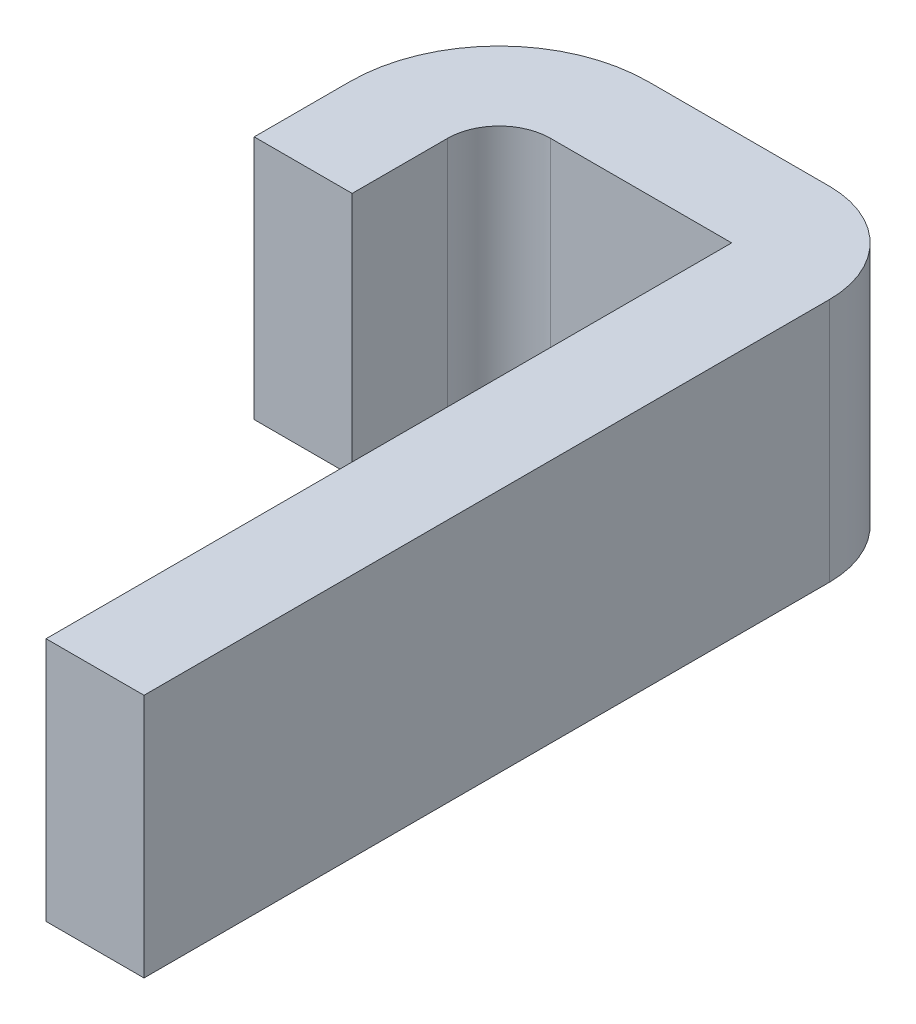
ISO-10303-21;
HEADER;
FILE_DESCRIPTION(('STEP AP214'),'2;1');
FILE_NAME('part.step','',(''),(''),'','','');
FILE_SCHEMA(('AUTOMOTIVE_DESIGN { 1 0 10303 214 1 1 1 1 }'));
ENDSEC;
DATA;
#1=APPLICATION_CONTEXT('core data for automotive mechanical design processes');
#2=APPLICATION_PROTOCOL_DEFINITION('international standard','automotive_design',2000,#1);
#3=PRODUCT_CONTEXT('',#1,'mechanical');
#4=PRODUCT('Part','Part','',(#3));
#5=PRODUCT_RELATED_PRODUCT_CATEGORY('part','',(#4));
#6=PRODUCT_DEFINITION_FORMATION('','',#4);
#7=PRODUCT_DEFINITION_CONTEXT('part definition',#1,'design');
#8=PRODUCT_DEFINITION('design','',#6,#7);
#9=PRODUCT_DEFINITION_SHAPE('','',#8);
#10=(LENGTH_UNIT() NAMED_UNIT(*) SI_UNIT(.MILLI.,.METRE.));
#11=(NAMED_UNIT(*) PLANE_ANGLE_UNIT() SI_UNIT($,.RADIAN.));
#12=(NAMED_UNIT(*) SI_UNIT($,.STERADIAN.) SOLID_ANGLE_UNIT());
#13=UNCERTAINTY_MEASURE_WITH_UNIT(LENGTH_MEASURE(1.E-05),#10,'distance_accuracy_value','');
#14=(GEOMETRIC_REPRESENTATION_CONTEXT(3) GLOBAL_UNCERTAINTY_ASSIGNED_CONTEXT((#13)) GLOBAL_UNIT_ASSIGNED_CONTEXT((#10,
#11,#12)) REPRESENTATION_CONTEXT('',''));
#15=CARTESIAN_POINT('',(0.,0.,0.));
#16=DIRECTION('',(0.,0.,1.));
#17=DIRECTION('',(1.,0.,0.));
#18=AXIS2_PLACEMENT_3D('',#15,#16,#17);
#19=CARTESIAN_POINT('',(-2.85,0.77,3.2));
#20=DIRECTION('',(1.,0.,0.));
#21=DIRECTION('',(0.,1.,0.));
#22=AXIS2_PLACEMENT_3D('',#19,#20,#21);
#23=PLANE('',#22);
#24=DIRECTION('',(0.,0.,1.));
#25=VECTOR('',#24,1.);
#26=CARTESIAN_POINT('',(-2.85,1.77,3.2));
#27=LINE('',#26,#25);
#28=CARTESIAN_POINT('',(-2.85,1.77,3.2));
#29=VERTEX_POINT('',#28);
#30=CARTESIAN_POINT('',(-2.85,1.77,0.4));
#31=VERTEX_POINT('',#30);
#32=EDGE_CURVE('E164',#29,#31,#27,.F.);
#33=ORIENTED_EDGE('',*,*,#32,.F.);
#34=DIRECTION('',(0.,1.,0.));
#35=VECTOR('',#34,1.);
#36=CARTESIAN_POINT('',(-2.85,1.27,3.2));
#37=LINE('',#36,#35);
#38=CARTESIAN_POINT('',(-2.85,0.77,3.2));
#39=VERTEX_POINT('',#38);
#40=EDGE_CURVE('E162',#39,#29,#37,.T.);
#41=ORIENTED_EDGE('',*,*,#40,.F.);
#42=DIRECTION('',(0.,0.,-1.));
#43=VECTOR('',#42,1.);
#44=CARTESIAN_POINT('',(-2.85,0.77,3.2));
#45=LINE('',#44,#43);
#46=CARTESIAN_POINT('',(-2.85,0.77,0.4));
#47=VERTEX_POINT('',#46);
#48=EDGE_CURVE('E174',#47,#39,#45,.F.);
#49=ORIENTED_EDGE('',*,*,#48,.F.);
#50=DIRECTION('',(0.,-1.,0.));
#51=VECTOR('',#50,1.);
#52=CARTESIAN_POINT('',(-2.85,0.,0.4));
#53=LINE('',#52,#51);
#54=EDGE_CURVE('E160',#31,#47,#53,.T.);
#55=ORIENTED_EDGE('',*,*,#54,.F.);
#56=EDGE_LOOP('',(#33,#41,#49,#55));
#57=FACE_BOUND('',#56,.T.);
#58=ADVANCED_FACE('F17',(#57),#23,.T.);
#59=CARTESIAN_POINT('',(-3.25,0.,0.4));
#60=DIRECTION('',(0.,-1.,0.));
#61=DIRECTION('',(0.,0.,-1.));
#62=AXIS2_PLACEMENT_3D('',#59,#60,#61);
#63=CYLINDRICAL_SURFACE('',#62,0.4);
#64=CARTESIAN_POINT('',(-3.25,1.77,0.4));
#65=DIRECTION('',(0.,-1.,0.));
#66=DIRECTION('',(0.,0.,-1.));
#67=AXIS2_PLACEMENT_3D('',#64,#65,#66);
#68=CIRCLE('',#67,0.4);
#69=CARTESIAN_POINT('',(-3.25,1.77,0.));
#70=VERTEX_POINT('',#69);
#71=EDGE_CURVE('E194',#31,#70,#68,.F.);
#72=ORIENTED_EDGE('',*,*,#71,.F.);
#73=ORIENTED_EDGE('',*,*,#54,.T.);
#74=CARTESIAN_POINT('',(-3.25,0.77,0.4));
#75=DIRECTION('',(0.,-1.,0.));
#76=DIRECTION('',(0.,0.,-1.));
#77=AXIS2_PLACEMENT_3D('',#74,#75,#76);
#78=CIRCLE('',#77,0.4);
#79=CARTESIAN_POINT('',(-3.25,0.77,0.));
#80=VERTEX_POINT('',#79);
#81=EDGE_CURVE('E197',#80,#47,#78,.T.);
#82=ORIENTED_EDGE('',*,*,#81,.F.);
#83=DIRECTION('',(0.,1.,0.));
#84=VECTOR('',#83,1.);
#85=CARTESIAN_POINT('',(-3.25,0.77,0.));
#86=LINE('',#85,#84);
#87=EDGE_CURVE('E158',#70,#80,#86,.F.);
#88=ORIENTED_EDGE('',*,*,#87,.F.);
#89=EDGE_LOOP('',(#72,#73,#82,#88));
#90=FACE_BOUND('',#89,.T.);
#91=ADVANCED_FACE('F242',(#90),#63,.T.);
#92=CARTESIAN_POINT('',(-3.25,0.77,0.));
#93=DIRECTION('',(0.,0.,-1.));
#94=DIRECTION('',(0.,1.,0.));
#95=AXIS2_PLACEMENT_3D('',#92,#93,#94);
#96=PLANE('',#95);
#97=DIRECTION('',(1.,0.,0.));
#98=VECTOR('',#97,1.);
#99=CARTESIAN_POINT('',(-2.85,1.77,0.));
#100=LINE('',#99,#98);
#101=CARTESIAN_POINT('',(-3.99,1.77,0.));
#102=VERTEX_POINT('',#101);
#103=EDGE_CURVE('E193',#70,#102,#100,.F.);
#104=ORIENTED_EDGE('',*,*,#103,.F.);
#105=ORIENTED_EDGE('',*,*,#87,.T.);
#106=DIRECTION('',(1.,0.,0.));
#107=VECTOR('',#106,1.);
#108=CARTESIAN_POINT('',(-3.25,0.77,0.));
#109=LINE('',#108,#107);
#110=CARTESIAN_POINT('',(-3.99,0.77,0.));
#111=VERTEX_POINT('',#110);
#112=EDGE_CURVE('E199',#111,#80,#109,.T.);
#113=ORIENTED_EDGE('',*,*,#112,.F.);
#114=DIRECTION('',(0.,-1.,0.));
#115=VECTOR('',#114,1.);
#116=CARTESIAN_POINT('',(-3.99,0.,0.));
#117=LINE('',#116,#115);
#118=EDGE_CURVE('E156',#102,#111,#117,.T.);
#119=ORIENTED_EDGE('',*,*,#118,.F.);
#120=EDGE_LOOP('',(#104,#105,#113,#119));
#121=FACE_BOUND('',#120,.T.);
#122=ADVANCED_FACE('F245',(#121),#96,.T.);
#123=CARTESIAN_POINT('',(-3.99,0.,0.61));
#124=DIRECTION('',(0.,-1.,0.));
#125=DIRECTION('',(0.,0.,-1.));
#126=AXIS2_PLACEMENT_3D('',#123,#124,#125);
#127=CYLINDRICAL_SURFACE('',#126,0.61);
#128=CARTESIAN_POINT('',(-3.99,1.77,0.61));
#129=DIRECTION('',(0.,-1.,0.));
#130=DIRECTION('',(0.,0.,-1.));
#131=AXIS2_PLACEMENT_3D('',#128,#129,#130);
#132=CIRCLE('',#131,0.61);
#133=CARTESIAN_POINT('',(-4.6,1.77,0.61));
#134=VERTEX_POINT('',#133);
#135=EDGE_CURVE('E190',#102,#134,#132,.F.);
#136=ORIENTED_EDGE('',*,*,#135,.F.);
#137=ORIENTED_EDGE('',*,*,#118,.T.);
#138=CARTESIAN_POINT('',(-3.99,0.77,0.61));
#139=DIRECTION('',(0.,-1.,0.));
#140=DIRECTION('',(0.,0.,-1.));
#141=AXIS2_PLACEMENT_3D('',#138,#139,#140);
#142=CIRCLE('',#141,0.61);
#143=CARTESIAN_POINT('',(-4.6,0.77,0.61));
#144=VERTEX_POINT('',#143);
#145=EDGE_CURVE('E200',#144,#111,#142,.T.);
#146=ORIENTED_EDGE('',*,*,#145,.F.);
#147=DIRECTION('',(0.,-1.,0.));
#148=VECTOR('',#147,1.);
#149=CARTESIAN_POINT('',(-4.6,0.77,0.61));
#150=LINE('',#149,#148);
#151=EDGE_CURVE('E152',#134,#144,#150,.T.);
#152=ORIENTED_EDGE('',*,*,#151,.F.);
#153=EDGE_LOOP('',(#136,#137,#146,#152));
#154=FACE_BOUND('',#153,.T.);
#155=ADVANCED_FACE('F248',(#154),#127,.T.);
#156=CARTESIAN_POINT('',(-4.6,0.77,0.61));
#157=DIRECTION('',(-1.,0.,0.));
#158=DIRECTION('',(0.,-1.,0.));
#159=AXIS2_PLACEMENT_3D('',#156,#157,#158);
#160=PLANE('',#159);
#161=DIRECTION('',(0.,0.,1.));
#162=VECTOR('',#161,1.);
#163=CARTESIAN_POINT('',(-4.6,1.77,3.2));
#164=LINE('',#163,#162);
#165=CARTESIAN_POINT('',(-4.6,1.77,1.));
#166=VERTEX_POINT('',#165);
#167=EDGE_CURVE('E148',#134,#166,#164,.T.);
#168=ORIENTED_EDGE('',*,*,#167,.F.);
#169=ORIENTED_EDGE('',*,*,#151,.T.);
#170=DIRECTION('',(0.,0.,-1.));
#171=VECTOR('',#170,1.);
#172=CARTESIAN_POINT('',(-4.6,0.77,3.2));
#173=LINE('',#172,#171);
#174=CARTESIAN_POINT('',(-4.6,0.77,1.));
#175=VERTEX_POINT('',#174);
#176=EDGE_CURVE('E186',#175,#144,#173,.T.);
#177=ORIENTED_EDGE('',*,*,#176,.F.);
#178=DIRECTION('',(0.,1.,0.));
#179=VECTOR('',#178,1.);
#180=CARTESIAN_POINT('',(-4.6,1.27,1.));
#181=LINE('',#180,#179);
#182=EDGE_CURVE('E141',#175,#166,#181,.T.);
#183=ORIENTED_EDGE('',*,*,#182,.T.);
#184=EDGE_LOOP('',(#168,#169,#177,#183));
#185=FACE_BOUND('',#184,.T.);
#186=ADVANCED_FACE('F252',(#185),#160,.T.);
#187=CARTESIAN_POINT('',(-4.4,1.27,1.));
#188=DIRECTION('',(0.,0.,-1.));
#189=DIRECTION('',(-1.,0.,0.));
#190=AXIS2_PLACEMENT_3D('',#187,#188,#189);
#191=PLANE('',#190);
#192=DIRECTION('',(1.,0.,0.));
#193=VECTOR('',#192,1.);
#194=CARTESIAN_POINT('',(-2.85,1.77,1.));
#195=LINE('',#194,#193);
#196=CARTESIAN_POINT('',(-4.2,1.77,1.));
#197=VERTEX_POINT('',#196);
#198=EDGE_CURVE('E144',#166,#197,#195,.T.);
#199=ORIENTED_EDGE('',*,*,#198,.F.);
#200=ORIENTED_EDGE('',*,*,#182,.F.);
#201=DIRECTION('',(1.,0.,0.));
#202=VECTOR('',#201,1.);
#203=CARTESIAN_POINT('',(-3.25,0.77,1.));
#204=LINE('',#203,#202);
#205=CARTESIAN_POINT('',(-4.2,0.77,1.));
#206=VERTEX_POINT('',#205);
#207=EDGE_CURVE('E120',#206,#175,#204,.F.);
#208=ORIENTED_EDGE('',*,*,#207,.F.);
#209=DIRECTION('',(0.,1.,0.));
#210=VECTOR('',#209,1.);
#211=CARTESIAN_POINT('',(-4.2,1.77,1.));
#212=LINE('',#211,#210);
#213=EDGE_CURVE('E112',#197,#206,#212,.F.);
#214=ORIENTED_EDGE('',*,*,#213,.F.);
#215=EDGE_LOOP('',(#199,#200,#208,#214));
#216=FACE_BOUND('',#215,.T.);
#217=ADVANCED_FACE('F254',(#216),#191,.F.);
#218=CARTESIAN_POINT('',(-4.2,1.77,0.61));
#219=DIRECTION('',(1.,0.,0.));
#220=DIRECTION('',(0.,0.,-1.));
#221=AXIS2_PLACEMENT_3D('',#218,#219,#220);
#222=PLANE('',#221);
#223=DIRECTION('',(0.,-1.,0.));
#224=VECTOR('',#223,1.);
#225=CARTESIAN_POINT('',(-4.2,0.,0.61));
#226=LINE('',#225,#224);
#227=CARTESIAN_POINT('',(-4.2,0.77,0.61));
#228=VERTEX_POINT('',#227);
#229=CARTESIAN_POINT('',(-4.2,1.77,0.61));
#230=VERTEX_POINT('',#229);
#231=EDGE_CURVE('E102',#228,#230,#226,.F.);
#232=ORIENTED_EDGE('',*,*,#231,.T.);
#233=DIRECTION('',(0.,0.,1.));
#234=VECTOR('',#233,1.);
#235=CARTESIAN_POINT('',(-4.2,1.77,3.2));
#236=LINE('',#235,#234);
#237=EDGE_CURVE('E147',#197,#230,#236,.F.);
#238=ORIENTED_EDGE('',*,*,#237,.F.);
#239=ORIENTED_EDGE('',*,*,#213,.T.);
#240=DIRECTION('',(0.,0.,-1.));
#241=VECTOR('',#240,1.);
#242=CARTESIAN_POINT('',(-4.2,0.77,3.2));
#243=LINE('',#242,#241);
#244=EDGE_CURVE('E115',#228,#206,#243,.F.);
#245=ORIENTED_EDGE('',*,*,#244,.F.);
#246=EDGE_LOOP('',(#232,#238,#239,#245));
#247=FACE_BOUND('',#246,.T.);
#248=ADVANCED_FACE('F116',(#247),#222,.T.);
#249=CARTESIAN_POINT('',(-3.99,0.,0.61));
#250=DIRECTION('',(0.,-1.,0.));
#251=DIRECTION('',(0.,0.,-1.));
#252=AXIS2_PLACEMENT_3D('',#249,#250,#251);
#253=CYLINDRICAL_SURFACE('',#252,0.21);
#254=CARTESIAN_POINT('',(-3.99,0.77,0.61));
#255=DIRECTION('',(0.,-1.,0.));
#256=DIRECTION('',(0.,0.,-1.));
#257=AXIS2_PLACEMENT_3D('',#254,#255,#256);
#258=CIRCLE('',#257,0.21);
#259=CARTESIAN_POINT('',(-3.99,0.77,0.4));
#260=VERTEX_POINT('',#259);
#261=EDGE_CURVE('E20',#260,#228,#258,.F.);
#262=ORIENTED_EDGE('',*,*,#261,.F.);
#263=DIRECTION('',(0.,1.,0.));
#264=VECTOR('',#263,1.);
#265=CARTESIAN_POINT('',(-3.99,1.77,0.4));
#266=LINE('',#265,#264);
#267=CARTESIAN_POINT('',(-3.99,1.77,0.4));
#268=VERTEX_POINT('',#267);
#269=EDGE_CURVE('E97',#268,#260,#266,.F.);
#270=ORIENTED_EDGE('',*,*,#269,.F.);
#271=CARTESIAN_POINT('',(-3.99,1.77,0.61));
#272=DIRECTION('',(0.,-1.,0.));
#273=DIRECTION('',(0.,0.,-1.));
#274=AXIS2_PLACEMENT_3D('',#271,#272,#273);
#275=CIRCLE('',#274,0.21);
#276=EDGE_CURVE('E108',#230,#268,#275,.T.);
#277=ORIENTED_EDGE('',*,*,#276,.F.);
#278=ORIENTED_EDGE('',*,*,#231,.F.);
#279=EDGE_LOOP('',(#262,#270,#277,#278));
#280=FACE_BOUND('',#279,.T.);
#281=ADVANCED_FACE('F104',(#280),#253,.F.);
#282=CARTESIAN_POINT('',(-3.25,1.77,0.4));
#283=DIRECTION('',(0.,0.,1.));
#284=DIRECTION('',(1.,0.,0.));
#285=AXIS2_PLACEMENT_3D('',#282,#283,#284);
#286=PLANE('',#285);
#287=DIRECTION('',(0.,1.,0.));
#288=VECTOR('',#287,1.);
#289=CARTESIAN_POINT('',(-3.25,1.77,0.4));
#290=LINE('',#289,#288);
#291=CARTESIAN_POINT('',(-3.25,1.77,0.4));
#292=VERTEX_POINT('',#291);
#293=CARTESIAN_POINT('',(-3.25,0.77,0.4));
#294=VERTEX_POINT('',#293);
#295=EDGE_CURVE('E132',#292,#294,#290,.F.);
#296=ORIENTED_EDGE('',*,*,#295,.F.);
#297=DIRECTION('',(1.,0.,0.));
#298=VECTOR('',#297,1.);
#299=CARTESIAN_POINT('',(-2.85,1.77,0.4));
#300=LINE('',#299,#298);
#301=EDGE_CURVE('E169',#268,#292,#300,.T.);
#302=ORIENTED_EDGE('',*,*,#301,.F.);
#303=ORIENTED_EDGE('',*,*,#269,.T.);
#304=DIRECTION('',(1.,0.,0.));
#305=VECTOR('',#304,1.);
#306=CARTESIAN_POINT('',(-3.25,0.77,0.4));
#307=LINE('',#306,#305);
#308=EDGE_CURVE('E124',#294,#260,#307,.F.);
#309=ORIENTED_EDGE('',*,*,#308,.F.);
#310=EDGE_LOOP('',(#296,#302,#303,#309));
#311=FACE_BOUND('',#310,.T.);
#312=ADVANCED_FACE('F275',(#311),#286,.T.);
#313=CARTESIAN_POINT('',(-3.25,0.77,3.2));
#314=DIRECTION('',(0.,-1.,0.));
#315=DIRECTION('',(0.,0.,-1.));
#316=AXIS2_PLACEMENT_3D('',#313,#314,#315);
#317=PLANE('',#316);
#318=ORIENTED_EDGE('',*,*,#48,.T.);
#319=DIRECTION('',(1.,0.,0.));
#320=VECTOR('',#319,1.);
#321=CARTESIAN_POINT('',(-3.05,0.77,3.2));
#322=LINE('',#321,#320);
#323=CARTESIAN_POINT('',(-3.25,0.77,3.2));
#324=VERTEX_POINT('',#323);
#325=EDGE_CURVE('E165',#324,#39,#322,.T.);
#326=ORIENTED_EDGE('',*,*,#325,.F.);
#327=DIRECTION('',(0.,0.,1.));
#328=VECTOR('',#327,1.);
#329=CARTESIAN_POINT('',(-3.25,0.77,3.2));
#330=LINE('',#329,#328);
#331=EDGE_CURVE('E135',#294,#324,#330,.T.);
#332=ORIENTED_EDGE('',*,*,#331,.F.);
#333=ORIENTED_EDGE('',*,*,#308,.T.);
#334=ORIENTED_EDGE('',*,*,#261,.T.);
#335=ORIENTED_EDGE('',*,*,#244,.T.);
#336=ORIENTED_EDGE('',*,*,#207,.T.);
#337=ORIENTED_EDGE('',*,*,#176,.T.);
#338=ORIENTED_EDGE('',*,*,#145,.T.);
#339=ORIENTED_EDGE('',*,*,#112,.T.);
#340=ORIENTED_EDGE('',*,*,#81,.T.);
#341=EDGE_LOOP('',(#318,#326,#332,#333,#334,#335,#336,#337,#338,#339,#340));
#342=FACE_BOUND('',#341,.T.);
#343=ADVANCED_FACE('F122',(#342),#317,.T.);
#344=CARTESIAN_POINT('',(-3.05,1.27,3.2));
#345=DIRECTION('',(0.,0.,1.));
#346=DIRECTION('',(1.,0.,0.));
#347=AXIS2_PLACEMENT_3D('',#344,#345,#346);
#348=PLANE('',#347);
#349=ORIENTED_EDGE('',*,*,#40,.T.);
#350=DIRECTION('',(1.,0.,0.));
#351=VECTOR('',#350,1.);
#352=CARTESIAN_POINT('',(-2.85,1.77,3.2));
#353=LINE('',#352,#351);
#354=CARTESIAN_POINT('',(-3.25,1.77,3.2));
#355=VERTEX_POINT('',#354);
#356=EDGE_CURVE('E35',#355,#29,#353,.T.);
#357=ORIENTED_EDGE('',*,*,#356,.F.);
#358=DIRECTION('',(0.,1.,0.));
#359=VECTOR('',#358,1.);
#360=CARTESIAN_POINT('',(-3.25,1.77,3.2));
#361=LINE('',#360,#359);
#362=EDGE_CURVE('E26',#324,#355,#361,.T.);
#363=ORIENTED_EDGE('',*,*,#362,.F.);
#364=ORIENTED_EDGE('',*,*,#325,.T.);
#365=EDGE_LOOP('',(#349,#357,#363,#364));
#366=FACE_BOUND('',#365,.T.);
#367=ADVANCED_FACE('F234',(#366),#348,.T.);
#368=CARTESIAN_POINT('',(-2.85,1.77,3.2));
#369=DIRECTION('',(0.,1.,0.));
#370=DIRECTION('',(0.,0.,1.));
#371=AXIS2_PLACEMENT_3D('',#368,#369,#370);
#372=PLANE('',#371);
#373=DIRECTION('',(0.,0.,1.));
#374=VECTOR('',#373,1.);
#375=CARTESIAN_POINT('',(-3.25,1.77,3.2));
#376=LINE('',#375,#374);
#377=EDGE_CURVE('E11',#355,#292,#376,.F.);
#378=ORIENTED_EDGE('',*,*,#377,.F.);
#379=ORIENTED_EDGE('',*,*,#356,.T.);
#380=ORIENTED_EDGE('',*,*,#32,.T.);
#381=ORIENTED_EDGE('',*,*,#71,.T.);
#382=ORIENTED_EDGE('',*,*,#103,.T.);
#383=ORIENTED_EDGE('',*,*,#135,.T.);
#384=ORIENTED_EDGE('',*,*,#167,.T.);
#385=ORIENTED_EDGE('',*,*,#198,.T.);
#386=ORIENTED_EDGE('',*,*,#237,.T.);
#387=ORIENTED_EDGE('',*,*,#276,.T.);
#388=ORIENTED_EDGE('',*,*,#301,.T.);
#389=EDGE_LOOP('',(#378,#379,#380,#381,#382,#383,#384,#385,#386,#387,#388));
#390=FACE_BOUND('',#389,.T.);
#391=ADVANCED_FACE('F231',(#390),#372,.T.);
#392=CARTESIAN_POINT('',(-3.25,1.77,3.2));
#393=DIRECTION('',(-1.,0.,0.));
#394=DIRECTION('',(0.,0.,1.));
#395=AXIS2_PLACEMENT_3D('',#392,#393,#394);
#396=PLANE('',#395);
#397=ORIENTED_EDGE('',*,*,#362,.T.);
#398=ORIENTED_EDGE('',*,*,#377,.T.);
#399=ORIENTED_EDGE('',*,*,#295,.T.);
#400=ORIENTED_EDGE('',*,*,#331,.T.);
#401=EDGE_LOOP('',(#397,#398,#399,#400));
#402=FACE_BOUND('',#401,.T.);
#403=ADVANCED_FACE('F233',(#402),#396,.T.);
#404=CLOSED_SHELL('',(#58,#91,#122,#155,#186,#217,#248,#281,#312,#343,#367,#391,#403));
#405=MANIFOLD_SOLID_BREP('B1',#404);
#406=ADVANCED_BREP_SHAPE_REPRESENTATION('',(#18,#405),#14);
#407=SHAPE_DEFINITION_REPRESENTATION(#9,#406);
ENDSEC;
END-ISO-10303-21;
